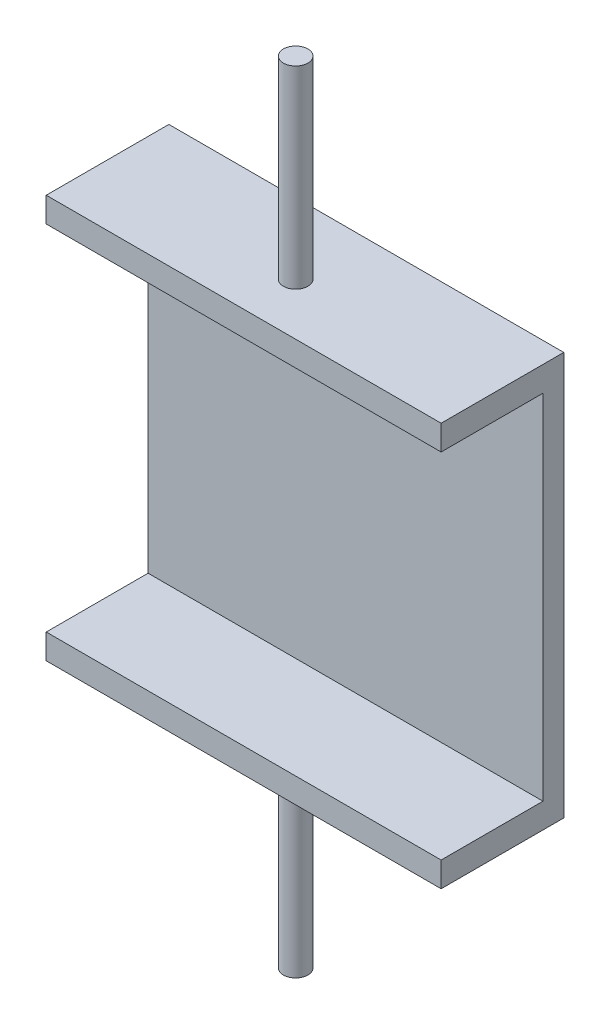
ISO-10303-21;
HEADER;
FILE_DESCRIPTION(('STEP AP214'),'2;1');
FILE_NAME('part.step','',(''),(''),'','','');
FILE_SCHEMA(('AUTOMOTIVE_DESIGN { 1 0 10303 214 1 1 1 1 }'));
ENDSEC;
DATA;
#1=APPLICATION_CONTEXT('core data for automotive mechanical design processes');
#2=APPLICATION_PROTOCOL_DEFINITION('international standard','automotive_design',2000,#1);
#3=PRODUCT_CONTEXT('',#1,'mechanical');
#4=PRODUCT('Part','Part','',(#3));
#5=PRODUCT_RELATED_PRODUCT_CATEGORY('part','',(#4));
#6=PRODUCT_DEFINITION_FORMATION('','',#4);
#7=PRODUCT_DEFINITION_CONTEXT('part definition',#1,'design');
#8=PRODUCT_DEFINITION('design','',#6,#7);
#9=PRODUCT_DEFINITION_SHAPE('','',#8);
#10=(LENGTH_UNIT() NAMED_UNIT(*) SI_UNIT(.MILLI.,.METRE.));
#11=(NAMED_UNIT(*) PLANE_ANGLE_UNIT() SI_UNIT($,.RADIAN.));
#12=(NAMED_UNIT(*) SI_UNIT($,.STERADIAN.) SOLID_ANGLE_UNIT());
#13=UNCERTAINTY_MEASURE_WITH_UNIT(LENGTH_MEASURE(1.E-05),#10,'distance_accuracy_value','');
#14=(GEOMETRIC_REPRESENTATION_CONTEXT(3) GLOBAL_UNCERTAINTY_ASSIGNED_CONTEXT((#13)) GLOBAL_UNIT_ASSIGNED_CONTEXT((#10,
#11,#12)) REPRESENTATION_CONTEXT('',''));
#15=CARTESIAN_POINT('',(0.,0.,0.));
#16=DIRECTION('',(0.,0.,1.));
#17=DIRECTION('',(1.,0.,0.));
#18=AXIS2_PLACEMENT_3D('',#15,#16,#17);
#19=CARTESIAN_POINT('',(205.,215.,133.));
#20=DIRECTION('',(1.,0.,0.));
#21=DIRECTION('',(0.,0.,-1.));
#22=AXIS2_PLACEMENT_3D('',#19,#20,#21);
#23=PLANE('',#22);
#24=DIRECTION('',(0.,-1.,0.));
#25=VECTOR('',#24,1.);
#26=CARTESIAN_POINT('',(205.,215.,123.));
#27=LINE('',#26,#25);
#28=CARTESIAN_POINT('',(205.,397.,123.));
#29=VERTEX_POINT('',#28);
#30=CARTESIAN_POINT('',(205.,203.,123.));
#31=VERTEX_POINT('',#30);
#32=EDGE_CURVE('E147',#29,#31,#27,.T.);
#33=ORIENTED_EDGE('',*,*,#32,.T.);
#34=DIRECTION('',(0.,0.,1.));
#35=VECTOR('',#34,1.);
#36=CARTESIAN_POINT('',(205.,203.,123.));
#37=LINE('',#36,#35);
#38=CARTESIAN_POINT('',(205.,203.,182.));
#39=VERTEX_POINT('',#38);
#40=EDGE_CURVE('E124',#31,#39,#37,.T.);
#41=ORIENTED_EDGE('',*,*,#40,.T.);
#42=DIRECTION('',(0.,-1.,0.));
#43=VECTOR('',#42,1.);
#44=CARTESIAN_POINT('',(205.,215.,182.));
#45=LINE('',#44,#43);
#46=CARTESIAN_POINT('',(205.,215.,182.));
#47=VERTEX_POINT('',#46);
#48=EDGE_CURVE('E117',#47,#39,#45,.T.);
#49=ORIENTED_EDGE('',*,*,#48,.F.);
#50=DIRECTION('',(0.,0.,1.));
#51=VECTOR('',#50,1.);
#52=CARTESIAN_POINT('',(205.,215.,123.));
#53=LINE('',#52,#51);
#54=CARTESIAN_POINT('',(205.,215.,133.));
#55=VERTEX_POINT('',#54);
#56=EDGE_CURVE('E101',#55,#47,#53,.T.);
#57=ORIENTED_EDGE('',*,*,#56,.F.);
#58=DIRECTION('',(0.,-1.,0.));
#59=VECTOR('',#58,1.);
#60=CARTESIAN_POINT('',(205.,215.,133.));
#61=LINE('',#60,#59);
#62=CARTESIAN_POINT('',(205.,385.,133.));
#63=VERTEX_POINT('',#62);
#64=EDGE_CURVE('E151',#63,#55,#61,.T.);
#65=ORIENTED_EDGE('',*,*,#64,.F.);
#66=DIRECTION('',(0.,0.,1.));
#67=VECTOR('',#66,1.);
#68=CARTESIAN_POINT('',(205.,385.,123.));
#69=LINE('',#68,#67);
#70=CARTESIAN_POINT('',(205.,385.,182.));
#71=VERTEX_POINT('',#70);
#72=EDGE_CURVE('E52',#63,#71,#69,.T.);
#73=ORIENTED_EDGE('',*,*,#72,.T.);
#74=DIRECTION('',(0.,-1.,0.));
#75=VECTOR('',#74,1.);
#76=CARTESIAN_POINT('',(205.,397.,182.));
#77=LINE('',#76,#75);
#78=CARTESIAN_POINT('',(205.,397.,182.));
#79=VERTEX_POINT('',#78);
#80=EDGE_CURVE('E150',#79,#71,#77,.T.);
#81=ORIENTED_EDGE('',*,*,#80,.F.);
#82=DIRECTION('',(0.,0.,1.));
#83=VECTOR('',#82,1.);
#84=CARTESIAN_POINT('',(205.,397.,123.));
#85=LINE('',#84,#83);
#86=EDGE_CURVE('E129',#29,#79,#85,.T.);
#87=ORIENTED_EDGE('',*,*,#86,.F.);
#88=EDGE_LOOP('',(#33,#41,#49,#57,#65,#73,#81,#87));
#89=FACE_BOUND('',#88,.T.);
#90=ADVANCED_FACE('F39',(#89),#23,.F.);
#91=CARTESIAN_POINT('',(395.,215.,133.));
#92=DIRECTION('',(-1.,0.,0.));
#93=DIRECTION('',(0.,0.,1.));
#94=AXIS2_PLACEMENT_3D('',#91,#92,#93);
#95=PLANE('',#94);
#96=DIRECTION('',(0.,1.,0.));
#97=VECTOR('',#96,1.);
#98=CARTESIAN_POINT('',(395.,215.,123.));
#99=LINE('',#98,#97);
#100=CARTESIAN_POINT('',(395.,203.,123.));
#101=VERTEX_POINT('',#100);
#102=CARTESIAN_POINT('',(395.,397.,123.));
#103=VERTEX_POINT('',#102);
#104=EDGE_CURVE('E153',#101,#103,#99,.T.);
#105=ORIENTED_EDGE('',*,*,#104,.T.);
#106=DIRECTION('',(0.,0.,-1.));
#107=VECTOR('',#106,1.);
#108=CARTESIAN_POINT('',(395.,397.,123.));
#109=LINE('',#108,#107);
#110=CARTESIAN_POINT('',(395.,397.,182.));
#111=VERTEX_POINT('',#110);
#112=EDGE_CURVE('E133',#111,#103,#109,.T.);
#113=ORIENTED_EDGE('',*,*,#112,.F.);
#114=DIRECTION('',(0.,-1.,0.));
#115=VECTOR('',#114,1.);
#116=CARTESIAN_POINT('',(395.,397.,182.));
#117=LINE('',#116,#115);
#118=CARTESIAN_POINT('',(395.,385.,182.));
#119=VERTEX_POINT('',#118);
#120=EDGE_CURVE('E138',#111,#119,#117,.T.);
#121=ORIENTED_EDGE('',*,*,#120,.T.);
#122=DIRECTION('',(0.,0.,-1.));
#123=VECTOR('',#122,1.);
#124=CARTESIAN_POINT('',(395.,385.,123.));
#125=LINE('',#124,#123);
#126=CARTESIAN_POINT('',(395.,385.,133.));
#127=VERTEX_POINT('',#126);
#128=EDGE_CURVE('E134',#119,#127,#125,.T.);
#129=ORIENTED_EDGE('',*,*,#128,.T.);
#130=DIRECTION('',(0.,1.,0.));
#131=VECTOR('',#130,1.);
#132=CARTESIAN_POINT('',(395.,215.,133.));
#133=LINE('',#132,#131);
#134=CARTESIAN_POINT('',(395.,215.,133.));
#135=VERTEX_POINT('',#134);
#136=EDGE_CURVE('E154',#135,#127,#133,.T.);
#137=ORIENTED_EDGE('',*,*,#136,.F.);
#138=DIRECTION('',(0.,0.,-1.));
#139=VECTOR('',#138,1.);
#140=CARTESIAN_POINT('',(395.,215.,123.));
#141=LINE('',#140,#139);
#142=CARTESIAN_POINT('',(395.,215.,182.));
#143=VERTEX_POINT('',#142);
#144=EDGE_CURVE('E62',#143,#135,#141,.T.);
#145=ORIENTED_EDGE('',*,*,#144,.F.);
#146=DIRECTION('',(0.,-1.,0.));
#147=VECTOR('',#146,1.);
#148=CARTESIAN_POINT('',(395.,215.,182.));
#149=LINE('',#148,#147);
#150=CARTESIAN_POINT('',(395.,203.,182.));
#151=VERTEX_POINT('',#150);
#152=EDGE_CURVE('E116',#143,#151,#149,.T.);
#153=ORIENTED_EDGE('',*,*,#152,.T.);
#154=DIRECTION('',(0.,0.,-1.));
#155=VECTOR('',#154,1.);
#156=CARTESIAN_POINT('',(395.,203.,123.));
#157=LINE('',#156,#155);
#158=EDGE_CURVE('E163',#151,#101,#157,.T.);
#159=ORIENTED_EDGE('',*,*,#158,.T.);
#160=EDGE_LOOP('',(#105,#113,#121,#129,#137,#145,#153,#159));
#161=FACE_BOUND('',#160,.T.);
#162=ADVANCED_FACE('F165',(#161),#95,.F.);
#163=CARTESIAN_POINT('',(0.,0.,133.));
#164=DIRECTION('',(0.,0.,-1.));
#165=DIRECTION('',(-1.,0.,0.));
#166=AXIS2_PLACEMENT_3D('',#163,#164,#165);
#167=PLANE('',#166);
#168=ORIENTED_EDGE('',*,*,#64,.T.);
#169=DIRECTION('',(1.,0.,0.));
#170=VECTOR('',#169,1.);
#171=CARTESIAN_POINT('',(205.,215.,133.));
#172=LINE('',#171,#170);
#173=EDGE_CURVE('E106',#55,#135,#172,.T.);
#174=ORIENTED_EDGE('',*,*,#173,.T.);
#175=ORIENTED_EDGE('',*,*,#136,.T.);
#176=DIRECTION('',(-1.,0.,0.));
#177=VECTOR('',#176,1.);
#178=CARTESIAN_POINT('',(205.,385.,133.));
#179=LINE('',#178,#177);
#180=EDGE_CURVE('E46',#127,#63,#179,.T.);
#181=ORIENTED_EDGE('',*,*,#180,.T.);
#182=EDGE_LOOP('',(#168,#174,#175,#181));
#183=FACE_BOUND('',#182,.T.);
#184=ADVANCED_FACE('F182',(#183),#167,.F.);
#185=CARTESIAN_POINT('',(0.,0.,123.));
#186=DIRECTION('',(0.,0.,-1.));
#187=DIRECTION('',(-1.,0.,0.));
#188=AXIS2_PLACEMENT_3D('',#185,#186,#187);
#189=PLANE('',#188);
#190=ORIENTED_EDGE('',*,*,#32,.F.);
#191=DIRECTION('',(-1.,0.,0.));
#192=VECTOR('',#191,1.);
#193=CARTESIAN_POINT('',(205.,397.,123.));
#194=LINE('',#193,#192);
#195=EDGE_CURVE('E140',#103,#29,#194,.T.);
#196=ORIENTED_EDGE('',*,*,#195,.F.);
#197=ORIENTED_EDGE('',*,*,#104,.F.);
#198=DIRECTION('',(-1.,0.,0.));
#199=VECTOR('',#198,1.);
#200=CARTESIAN_POINT('',(205.,203.,123.));
#201=LINE('',#200,#199);
#202=EDGE_CURVE('E112',#101,#31,#201,.T.);
#203=ORIENTED_EDGE('',*,*,#202,.T.);
#204=EDGE_LOOP('',(#190,#196,#197,#203));
#205=FACE_BOUND('',#204,.T.);
#206=ADVANCED_FACE('F174',(#205),#189,.T.);
#207=CARTESIAN_POINT('',(205.,397.,182.));
#208=DIRECTION('',(0.,0.,-1.));
#209=DIRECTION('',(-1.,0.,0.));
#210=AXIS2_PLACEMENT_3D('',#207,#208,#209);
#211=PLANE('',#210);
#212=DIRECTION('',(1.,0.,0.));
#213=VECTOR('',#212,1.);
#214=CARTESIAN_POINT('',(205.,385.,182.));
#215=LINE('',#214,#213);
#216=EDGE_CURVE('E121',#71,#119,#215,.T.);
#217=ORIENTED_EDGE('',*,*,#216,.T.);
#218=ORIENTED_EDGE('',*,*,#120,.F.);
#219=DIRECTION('',(1.,0.,0.));
#220=VECTOR('',#219,1.);
#221=CARTESIAN_POINT('',(205.,397.,182.));
#222=LINE('',#221,#220);
#223=EDGE_CURVE('E135',#79,#111,#222,.T.);
#224=ORIENTED_EDGE('',*,*,#223,.F.);
#225=ORIENTED_EDGE('',*,*,#80,.T.);
#226=EDGE_LOOP('',(#217,#218,#224,#225));
#227=FACE_BOUND('',#226,.T.);
#228=ADVANCED_FACE('F177',(#227),#211,.F.);
#229=CARTESIAN_POINT('',(0.,397.,0.));
#230=DIRECTION('',(0.,1.,0.));
#231=DIRECTION('',(0.,0.,1.));
#232=AXIS2_PLACEMENT_3D('',#229,#230,#231);
#233=PLANE('',#232);
#234=CARTESIAN_POINT('',(300.,397.,157.));
#235=DIRECTION('',(0.,1.,0.));
#236=DIRECTION('',(0.,0.,1.));
#237=AXIS2_PLACEMENT_3D('',#234,#235,#236);
#238=CIRCLE('',#237,5.9);
#239=CARTESIAN_POINT('',(300.,397.,162.9));
#240=VERTEX_POINT('',#239);
#241=EDGE_CURVE('E187',#240,#240,#238,.F.);
#242=ORIENTED_EDGE('',*,*,#241,.T.);
#243=EDGE_LOOP('',(#242));
#244=FACE_BOUND('',#243,.T.);
#245=ORIENTED_EDGE('',*,*,#86,.T.);
#246=ORIENTED_EDGE('',*,*,#223,.T.);
#247=ORIENTED_EDGE('',*,*,#112,.T.);
#248=ORIENTED_EDGE('',*,*,#195,.T.);
#249=EDGE_LOOP('',(#245,#246,#247,#248));
#250=FACE_BOUND('',#249,.T.);
#251=ADVANCED_FACE('F168',(#244,#250),#233,.T.);
#252=CARTESIAN_POINT('',(0.,385.,0.));
#253=DIRECTION('',(0.,1.,0.));
#254=DIRECTION('',(0.,0.,1.));
#255=AXIS2_PLACEMENT_3D('',#252,#253,#254);
#256=PLANE('',#255);
#257=ORIENTED_EDGE('',*,*,#180,.F.);
#258=ORIENTED_EDGE('',*,*,#128,.F.);
#259=ORIENTED_EDGE('',*,*,#216,.F.);
#260=ORIENTED_EDGE('',*,*,#72,.F.);
#261=EDGE_LOOP('',(#257,#258,#259,#260));
#262=FACE_BOUND('',#261,.T.);
#263=ADVANCED_FACE('F176',(#262),#256,.F.);
#264=CARTESIAN_POINT('',(0.,215.,0.));
#265=DIRECTION('',(0.,1.,0.));
#266=DIRECTION('',(0.,0.,1.));
#267=AXIS2_PLACEMENT_3D('',#264,#265,#266);
#268=PLANE('',#267);
#269=ORIENTED_EDGE('',*,*,#173,.F.);
#270=ORIENTED_EDGE('',*,*,#56,.T.);
#271=DIRECTION('',(1.,0.,0.));
#272=VECTOR('',#271,1.);
#273=CARTESIAN_POINT('',(205.,215.,182.));
#274=LINE('',#273,#272);
#275=EDGE_CURVE('E102',#47,#143,#274,.T.);
#276=ORIENTED_EDGE('',*,*,#275,.T.);
#277=ORIENTED_EDGE('',*,*,#144,.T.);
#278=EDGE_LOOP('',(#269,#270,#276,#277));
#279=FACE_BOUND('',#278,.T.);
#280=ADVANCED_FACE('F103',(#279),#268,.T.);
#281=CARTESIAN_POINT('',(205.,215.,182.));
#282=DIRECTION('',(0.,0.,-1.));
#283=DIRECTION('',(-1.,0.,0.));
#284=AXIS2_PLACEMENT_3D('',#281,#282,#283);
#285=PLANE('',#284);
#286=DIRECTION('',(1.,0.,0.));
#287=VECTOR('',#286,1.);
#288=CARTESIAN_POINT('',(205.,203.,182.));
#289=LINE('',#288,#287);
#290=EDGE_CURVE('E183',#39,#151,#289,.T.);
#291=ORIENTED_EDGE('',*,*,#290,.T.);
#292=ORIENTED_EDGE('',*,*,#152,.F.);
#293=ORIENTED_EDGE('',*,*,#275,.F.);
#294=ORIENTED_EDGE('',*,*,#48,.T.);
#295=EDGE_LOOP('',(#291,#292,#293,#294));
#296=FACE_BOUND('',#295,.T.);
#297=ADVANCED_FACE('F113',(#296),#285,.F.);
#298=CARTESIAN_POINT('',(0.,203.,0.));
#299=DIRECTION('',(0.,1.,0.));
#300=DIRECTION('',(0.,0.,1.));
#301=AXIS2_PLACEMENT_3D('',#298,#299,#300);
#302=PLANE('',#301);
#303=CARTESIAN_POINT('',(300.,203.,157.));
#304=DIRECTION('',(0.,1.,0.));
#305=DIRECTION('',(0.,0.,1.));
#306=AXIS2_PLACEMENT_3D('',#303,#304,#305);
#307=CIRCLE('',#306,5.9);
#308=CARTESIAN_POINT('',(300.,203.,162.9));
#309=VERTEX_POINT('',#308);
#310=EDGE_CURVE('E11',#309,#309,#307,.F.);
#311=ORIENTED_EDGE('',*,*,#310,.F.);
#312=EDGE_LOOP('',(#311));
#313=FACE_BOUND('',#312,.T.);
#314=ORIENTED_EDGE('',*,*,#40,.F.);
#315=ORIENTED_EDGE('',*,*,#202,.F.);
#316=ORIENTED_EDGE('',*,*,#158,.F.);
#317=ORIENTED_EDGE('',*,*,#290,.F.);
#318=EDGE_LOOP('',(#314,#315,#316,#317));
#319=FACE_BOUND('',#318,.T.);
#320=ADVANCED_FACE('F186',(#313,#319),#302,.F.);
#321=CARTESIAN_POINT('',(300.,490.,157.));
#322=DIRECTION('',(0.,-1.,0.));
#323=DIRECTION('',(0.,0.,-1.));
#324=AXIS2_PLACEMENT_3D('',#321,#322,#323);
#325=CYLINDRICAL_SURFACE('',#324,5.9);
#326=ORIENTED_EDGE('',*,*,#241,.F.);
#327=EDGE_LOOP('',(#326));
#328=FACE_BOUND('',#327,.T.);
#329=CARTESIAN_POINT('',(300.,490.,157.));
#330=DIRECTION('',(0.,1.,0.));
#331=DIRECTION('',(0.,0.,1.));
#332=AXIS2_PLACEMENT_3D('',#329,#330,#331);
#333=CIRCLE('',#332,5.9);
#334=CARTESIAN_POINT('',(300.,490.,162.9));
#335=VERTEX_POINT('',#334);
#336=EDGE_CURVE('E230',#335,#335,#333,.T.);
#337=ORIENTED_EDGE('',*,*,#336,.F.);
#338=EDGE_LOOP('',(#337));
#339=FACE_BOUND('',#338,.T.);
#340=ADVANCED_FACE('F192',(#328,#339),#325,.T.);
#341=CARTESIAN_POINT('',(300.,490.,157.));
#342=DIRECTION('',(0.,1.,0.));
#343=DIRECTION('',(0.,0.,1.));
#344=AXIS2_PLACEMENT_3D('',#341,#342,#343);
#345=PLANE('',#344);
#346=ORIENTED_EDGE('',*,*,#336,.T.);
#347=EDGE_LOOP('',(#346));
#348=FACE_BOUND('',#347,.T.);
#349=ADVANCED_FACE('F200',(#348),#345,.T.);
#350=CARTESIAN_POINT('',(300.,215.,157.));
#351=DIRECTION('',(0.,-1.,0.));
#352=DIRECTION('',(0.,0.,-1.));
#353=AXIS2_PLACEMENT_3D('',#350,#351,#352);
#354=CYLINDRICAL_SURFACE('',#353,5.9);
#355=CARTESIAN_POINT('',(300.,110.,157.));
#356=DIRECTION('',(0.,1.,0.));
#357=DIRECTION('',(0.,0.,1.));
#358=AXIS2_PLACEMENT_3D('',#355,#356,#357);
#359=CIRCLE('',#358,5.9);
#360=CARTESIAN_POINT('',(300.,110.,162.9));
#361=VERTEX_POINT('',#360);
#362=EDGE_CURVE('E228',#361,#361,#359,.T.);
#363=ORIENTED_EDGE('',*,*,#362,.T.);
#364=EDGE_LOOP('',(#363));
#365=FACE_BOUND('',#364,.T.);
#366=ORIENTED_EDGE('',*,*,#310,.T.);
#367=EDGE_LOOP('',(#366));
#368=FACE_BOUND('',#367,.T.);
#369=ADVANCED_FACE('F237',(#365,#368),#354,.T.);
#370=CARTESIAN_POINT('',(300.,110.,157.));
#371=DIRECTION('',(0.,1.,0.));
#372=DIRECTION('',(0.,0.,1.));
#373=AXIS2_PLACEMENT_3D('',#370,#371,#372);
#374=PLANE('',#373);
#375=ORIENTED_EDGE('',*,*,#362,.F.);
#376=EDGE_LOOP('',(#375));
#377=FACE_BOUND('',#376,.T.);
#378=ADVANCED_FACE('F239',(#377),#374,.F.);
#379=CLOSED_SHELL('',(#90,#162,#184,#206,#228,#251,#263,#280,#297,#320,#340,#349,#369,#378));
#380=MANIFOLD_SOLID_BREP('B2',#379);
#381=ADVANCED_BREP_SHAPE_REPRESENTATION('',(#18,#380),#14);
#382=SHAPE_DEFINITION_REPRESENTATION(#9,#381);
ENDSEC;
END-ISO-10303-21;
